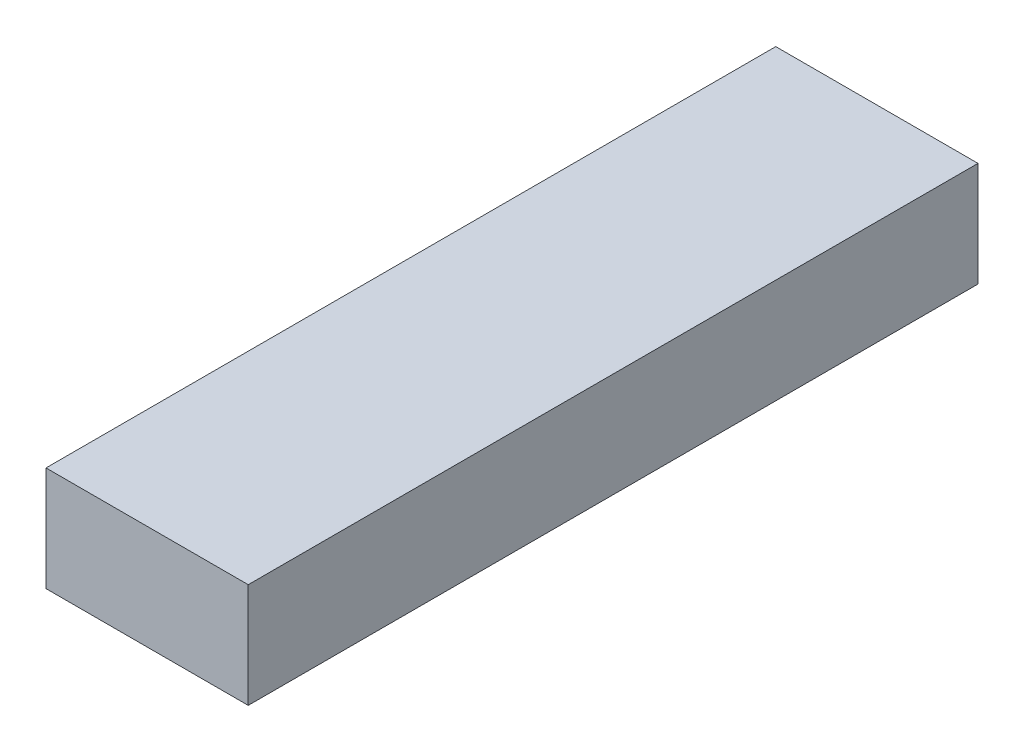
ISO-10303-21;
HEADER;
FILE_DESCRIPTION(('STEP AP214'),'2;1');
FILE_NAME('part.step','',(''),(''),'','','');
FILE_SCHEMA(('AUTOMOTIVE_DESIGN { 1 0 10303 214 1 1 1 1 }'));
ENDSEC;
DATA;
#1=APPLICATION_CONTEXT('core data for automotive mechanical design processes');
#2=APPLICATION_PROTOCOL_DEFINITION('international standard','automotive_design',2000,#1);
#3=PRODUCT_CONTEXT('',#1,'mechanical');
#4=PRODUCT('Part','Part','',(#3));
#5=PRODUCT_RELATED_PRODUCT_CATEGORY('part','',(#4));
#6=PRODUCT_DEFINITION_FORMATION('','',#4);
#7=PRODUCT_DEFINITION_CONTEXT('part definition',#1,'design');
#8=PRODUCT_DEFINITION('design','',#6,#7);
#9=PRODUCT_DEFINITION_SHAPE('','',#8);
#10=(LENGTH_UNIT() NAMED_UNIT(*) SI_UNIT(.MILLI.,.METRE.));
#11=(NAMED_UNIT(*) PLANE_ANGLE_UNIT() SI_UNIT($,.RADIAN.));
#12=(NAMED_UNIT(*) SI_UNIT($,.STERADIAN.) SOLID_ANGLE_UNIT());
#13=UNCERTAINTY_MEASURE_WITH_UNIT(LENGTH_MEASURE(1.E-05),#10,'distance_accuracy_value','');
#14=(GEOMETRIC_REPRESENTATION_CONTEXT(3) GLOBAL_UNCERTAINTY_ASSIGNED_CONTEXT((#13)) GLOBAL_UNIT_ASSIGNED_CONTEXT((#10,
#11,#12)) REPRESENTATION_CONTEXT('',''));
#15=CARTESIAN_POINT('',(0.,0.,0.));
#16=DIRECTION('',(0.,0.,1.));
#17=DIRECTION('',(1.,0.,0.));
#18=AXIS2_PLACEMENT_3D('',#15,#16,#17);
#19=CARTESIAN_POINT('',(-16.4433081387597,8.5,-23.0788018796577));
#20=DIRECTION('',(1.,0.,0.));
#21=DIRECTION('',(0.,0.,-1.));
#22=AXIS2_PLACEMENT_3D('',#19,#20,#21);
#23=PLANE('',#22);
#24=DIRECTION('',(0.,0.,1.));
#25=VECTOR('',#24,1.);
#26=CARTESIAN_POINT('',(-16.4433081387597,1.5,-23.0788018796577));
#27=LINE('',#26,#25);
#28=CARTESIAN_POINT('',(-16.4433081387597,1.5,-23.0788018796577));
#29=VERTEX_POINT('',#28);
#30=CARTESIAN_POINT('',(-16.4433081387597,1.5,25.7844058514816));
#31=VERTEX_POINT('',#30);
#32=EDGE_CURVE('E107',#29,#31,#27,.T.);
#33=ORIENTED_EDGE('',*,*,#32,.T.);
#34=DIRECTION('',(0.,-1.,0.));
#35=VECTOR('',#34,1.);
#36=CARTESIAN_POINT('',(-16.4433081387597,8.5,25.7844058514816));
#37=LINE('',#36,#35);
#38=CARTESIAN_POINT('',(-16.4433081387597,8.5,25.7844058514816));
#39=VERTEX_POINT('',#38);
#40=EDGE_CURVE('E11',#39,#31,#37,.T.);
#41=ORIENTED_EDGE('',*,*,#40,.F.);
#42=DIRECTION('',(0.,0.,1.));
#43=VECTOR('',#42,1.);
#44=CARTESIAN_POINT('',(-16.4433081387597,8.5,-23.0788018796577));
#45=LINE('',#44,#43);
#46=CARTESIAN_POINT('',(-16.4433081387597,8.5,-23.0788018796577));
#47=VERTEX_POINT('',#46);
#48=EDGE_CURVE('E90',#47,#39,#45,.T.);
#49=ORIENTED_EDGE('',*,*,#48,.F.);
#50=DIRECTION('',(0.,-1.,0.));
#51=VECTOR('',#50,1.);
#52=CARTESIAN_POINT('',(-16.4433081387597,8.5,-23.0788018796577));
#53=LINE('',#52,#51);
#54=EDGE_CURVE('E103',#47,#29,#53,.T.);
#55=ORIENTED_EDGE('',*,*,#54,.T.);
#56=EDGE_LOOP('',(#33,#41,#49,#55));
#57=FACE_BOUND('',#56,.T.);
#58=ADVANCED_FACE('F38',(#57),#23,.F.);
#59=CARTESIAN_POINT('',(-16.4433081387597,8.5,25.7844058514816));
#60=DIRECTION('',(0.,0.,-1.));
#61=DIRECTION('',(-1.,0.,0.));
#62=AXIS2_PLACEMENT_3D('',#59,#60,#61);
#63=PLANE('',#62);
#64=DIRECTION('',(1.,0.,0.));
#65=VECTOR('',#64,1.);
#66=CARTESIAN_POINT('',(-16.4433081387597,1.5,25.7844058514816));
#67=LINE('',#66,#65);
#68=CARTESIAN_POINT('',(-2.90176025978112,1.5,25.7844058514816));
#69=VERTEX_POINT('',#68);
#70=EDGE_CURVE('E95',#31,#69,#67,.T.);
#71=ORIENTED_EDGE('',*,*,#70,.T.);
#72=DIRECTION('',(0.,-1.,0.));
#73=VECTOR('',#72,1.);
#74=CARTESIAN_POINT('',(-2.90176025978112,8.5,25.7844058514816));
#75=LINE('',#74,#73);
#76=CARTESIAN_POINT('',(-2.90176025978112,8.5,25.7844058514816));
#77=VERTEX_POINT('',#76);
#78=EDGE_CURVE('E47',#77,#69,#75,.T.);
#79=ORIENTED_EDGE('',*,*,#78,.F.);
#80=DIRECTION('',(1.,0.,0.));
#81=VECTOR('',#80,1.);
#82=CARTESIAN_POINT('',(-16.4433081387597,8.5,25.7844058514816));
#83=LINE('',#82,#81);
#84=EDGE_CURVE('E85',#39,#77,#83,.T.);
#85=ORIENTED_EDGE('',*,*,#84,.F.);
#86=ORIENTED_EDGE('',*,*,#40,.T.);
#87=EDGE_LOOP('',(#71,#79,#85,#86));
#88=FACE_BOUND('',#87,.T.);
#89=ADVANCED_FACE('F94',(#88),#63,.F.);
#90=CARTESIAN_POINT('',(-2.90176025978112,8.5,-23.0788018796577));
#91=DIRECTION('',(-1.,0.,0.));
#92=DIRECTION('',(0.,0.,1.));
#93=AXIS2_PLACEMENT_3D('',#90,#91,#92);
#94=PLANE('',#93);
#95=DIRECTION('',(0.,0.,-1.));
#96=VECTOR('',#95,1.);
#97=CARTESIAN_POINT('',(-2.90176025978112,1.5,-23.0788018796577));
#98=LINE('',#97,#96);
#99=CARTESIAN_POINT('',(-2.90176025978112,1.5,-23.0788018796577));
#100=VERTEX_POINT('',#99);
#101=EDGE_CURVE('E72',#69,#100,#98,.T.);
#102=ORIENTED_EDGE('',*,*,#101,.T.);
#103=DIRECTION('',(0.,-1.,0.));
#104=VECTOR('',#103,1.);
#105=CARTESIAN_POINT('',(-2.90176025978112,8.5,-23.0788018796577));
#106=LINE('',#105,#104);
#107=CARTESIAN_POINT('',(-2.90176025978112,8.5,-23.0788018796577));
#108=VERTEX_POINT('',#107);
#109=EDGE_CURVE('E97',#108,#100,#106,.T.);
#110=ORIENTED_EDGE('',*,*,#109,.F.);
#111=DIRECTION('',(0.,0.,-1.));
#112=VECTOR('',#111,1.);
#113=CARTESIAN_POINT('',(-2.90176025978112,8.5,-23.0788018796577));
#114=LINE('',#113,#112);
#115=EDGE_CURVE('E88',#77,#108,#114,.T.);
#116=ORIENTED_EDGE('',*,*,#115,.F.);
#117=ORIENTED_EDGE('',*,*,#78,.T.);
#118=EDGE_LOOP('',(#102,#110,#116,#117));
#119=FACE_BOUND('',#118,.T.);
#120=ADVANCED_FACE('F98',(#119),#94,.F.);
#121=CARTESIAN_POINT('',(-16.4433081387597,8.5,-23.0788018796577));
#122=DIRECTION('',(0.,0.,1.));
#123=DIRECTION('',(1.,0.,0.));
#124=AXIS2_PLACEMENT_3D('',#121,#122,#123);
#125=PLANE('',#124);
#126=DIRECTION('',(-1.,0.,0.));
#127=VECTOR('',#126,1.);
#128=CARTESIAN_POINT('',(-16.4433081387597,1.5,-23.0788018796577));
#129=LINE('',#128,#127);
#130=EDGE_CURVE('E78',#100,#29,#129,.T.);
#131=ORIENTED_EDGE('',*,*,#130,.T.);
#132=ORIENTED_EDGE('',*,*,#54,.F.);
#133=DIRECTION('',(-1.,0.,0.));
#134=VECTOR('',#133,1.);
#135=CARTESIAN_POINT('',(-16.4433081387597,8.5,-23.0788018796577));
#136=LINE('',#135,#134);
#137=EDGE_CURVE('E55',#108,#47,#136,.T.);
#138=ORIENTED_EDGE('',*,*,#137,.F.);
#139=ORIENTED_EDGE('',*,*,#109,.T.);
#140=EDGE_LOOP('',(#131,#132,#138,#139));
#141=FACE_BOUND('',#140,.T.);
#142=ADVANCED_FACE('F119',(#141),#125,.F.);
#143=CARTESIAN_POINT('',(-2.90176025978112,8.5,0.405840595773585));
#144=DIRECTION('',(0.,1.,0.));
#145=DIRECTION('',(0.,0.,1.));
#146=AXIS2_PLACEMENT_3D('',#143,#144,#145);
#147=PLANE('',#146);
#148=ORIENTED_EDGE('',*,*,#48,.T.);
#149=ORIENTED_EDGE('',*,*,#84,.T.);
#150=ORIENTED_EDGE('',*,*,#115,.T.);
#151=ORIENTED_EDGE('',*,*,#137,.T.);
#152=EDGE_LOOP('',(#148,#149,#150,#151));
#153=FACE_BOUND('',#152,.T.);
#154=ADVANCED_FACE('F86',(#153),#147,.T.);
#155=CARTESIAN_POINT('',(-2.90176025978112,1.5,0.405840595773585));
#156=DIRECTION('',(0.,1.,0.));
#157=DIRECTION('',(0.,0.,1.));
#158=AXIS2_PLACEMENT_3D('',#155,#156,#157);
#159=PLANE('',#158);
#160=ORIENTED_EDGE('',*,*,#32,.F.);
#161=ORIENTED_EDGE('',*,*,#130,.F.);
#162=ORIENTED_EDGE('',*,*,#101,.F.);
#163=ORIENTED_EDGE('',*,*,#70,.F.);
#164=EDGE_LOOP('',(#160,#161,#162,#163));
#165=FACE_BOUND('',#164,.T.);
#166=ADVANCED_FACE('F122',(#165),#159,.F.);
#167=CLOSED_SHELL('',(#58,#89,#120,#142,#154,#166));
#168=MANIFOLD_SOLID_BREP('B2',#167);
#169=ADVANCED_BREP_SHAPE_REPRESENTATION('',(#18,#168),#14);
#170=SHAPE_DEFINITION_REPRESENTATION(#9,#169);
ENDSEC;
END-ISO-10303-21;
